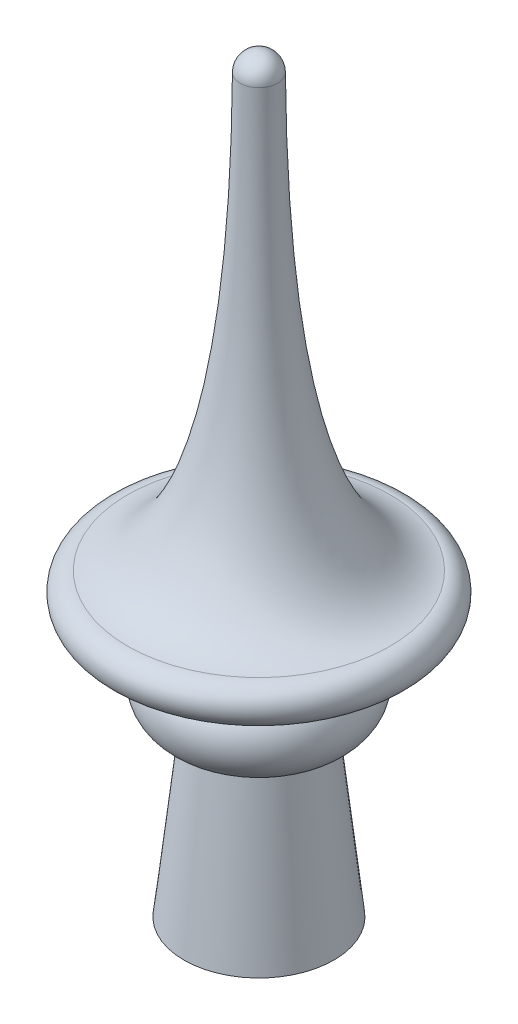
ISO-10303-21;
HEADER;
FILE_DESCRIPTION(('STEP AP214'),'2;1');
FILE_NAME('part.step','',(''),(''),'','','');
FILE_SCHEMA(('AUTOMOTIVE_DESIGN { 1 0 10303 214 1 1 1 1 }'));
ENDSEC;
DATA;
#1=APPLICATION_CONTEXT('core data for automotive mechanical design processes');
#2=APPLICATION_PROTOCOL_DEFINITION('international standard','automotive_design',2000,#1);
#3=PRODUCT_CONTEXT('',#1,'mechanical');
#4=PRODUCT('Part','Part','',(#3));
#5=PRODUCT_RELATED_PRODUCT_CATEGORY('part','',(#4));
#6=PRODUCT_DEFINITION_FORMATION('','',#4);
#7=PRODUCT_DEFINITION_CONTEXT('part definition',#1,'design');
#8=PRODUCT_DEFINITION('design','',#6,#7);
#9=PRODUCT_DEFINITION_SHAPE('','',#8);
#10=(LENGTH_UNIT() NAMED_UNIT(*) SI_UNIT(.MILLI.,.METRE.));
#11=(NAMED_UNIT(*) PLANE_ANGLE_UNIT() SI_UNIT($,.RADIAN.));
#12=(NAMED_UNIT(*) SI_UNIT($,.STERADIAN.) SOLID_ANGLE_UNIT());
#13=UNCERTAINTY_MEASURE_WITH_UNIT(LENGTH_MEASURE(1.E-05),#10,'distance_accuracy_value','');
#14=(GEOMETRIC_REPRESENTATION_CONTEXT(3) GLOBAL_UNCERTAINTY_ASSIGNED_CONTEXT((#13)) GLOBAL_UNIT_ASSIGNED_CONTEXT((#10,
#11,#12)) REPRESENTATION_CONTEXT('',''));
#15=CARTESIAN_POINT('',(0.,0.,0.));
#16=DIRECTION('',(0.,0.,1.));
#17=DIRECTION('',(1.,0.,0.));
#18=AXIS2_PLACEMENT_3D('',#15,#16,#17);
#19=CARTESIAN_POINT('',(0.,195.,0.));
#20=DIRECTION('',(0.,1.,0.));
#21=DIRECTION('',(1.,0.,0.));
#22=AXIS2_PLACEMENT_3D('',#19,#20,#21);
#23=SPHERICAL_SURFACE('',#22,4.99999999999988);
#24=CARTESIAN_POINT('',(0.,195.,0.));
#25=DIRECTION('',(0.,1.,0.));
#26=DIRECTION('',(0.,0.,1.));
#27=AXIS2_PLACEMENT_3D('',#24,#25,#26);
#28=CIRCLE('',#27,5.00000000000001);
#29=CARTESIAN_POINT('',(0.,195.,5.00000000000001));
#30=VERTEX_POINT('',#29);
#31=EDGE_CURVE('E10',#30,#30,#28,.T.);
#32=ORIENTED_EDGE('',*,*,#31,.T.);
#33=EDGE_LOOP('',(#32));
#34=FACE_BOUND('',#33,.T.);
#35=ADVANCED_FACE('F31',(#34),#23,.T.);
#36=CARTESIAN_POINT('',(35.0000000000003,79.9999999999999,0.));
#37=CARTESIAN_POINT('',(5.71754672525257,84.9631749134659,0.));
#38=CARTESIAN_POINT('',(5.00000000000001,195.,0.));
#39=B_SPLINE_CURVE_WITH_KNOTS('',2,(#36,#37,#38),.UNSPECIFIED.,.F.,.F.,(3,3),(0.,1.),.UNSPECIFIED.);
#40=CARTESIAN_POINT('',(0.,200.,0.));
#41=DIRECTION('',(0.,1.,0.));
#42=AXIS1_PLACEMENT('',#40,#41);
#43=SURFACE_OF_REVOLUTION('',#39,#42);
#44=ORIENTED_EDGE('',*,*,#31,.F.);
#45=EDGE_LOOP('',(#44));
#46=FACE_BOUND('',#45,.T.);
#47=CARTESIAN_POINT('',(0.,80.,0.));
#48=DIRECTION('',(0.,1.,0.));
#49=DIRECTION('',(0.,0.,1.));
#50=AXIS2_PLACEMENT_3D('',#47,#48,#49);
#51=CIRCLE('',#50,35.);
#52=CARTESIAN_POINT('',(0.,80.,35.));
#53=VERTEX_POINT('',#52);
#54=EDGE_CURVE('E37',#53,#53,#51,.T.);
#55=ORIENTED_EDGE('',*,*,#54,.T.);
#56=EDGE_LOOP('',(#55));
#57=FACE_BOUND('',#56,.T.);
#58=ADVANCED_FACE('F69',(#46,#57),#43,.T.);
#59=CARTESIAN_POINT('',(0.,75.,0.));
#60=DIRECTION('',(0.,1.,0.));
#61=DIRECTION('',(0.,0.,1.));
#62=AXIS2_PLACEMENT_3D('',#59,#60,#61);
#63=TOROIDAL_SURFACE('',#62,35.,5.);
#64=ORIENTED_EDGE('',*,*,#54,.F.);
#65=EDGE_LOOP('',(#64));
#66=FACE_BOUND('',#65,.T.);
#67=CARTESIAN_POINT('',(0.,70.,0.));
#68=DIRECTION('',(0.,1.,0.));
#69=DIRECTION('',(0.,0.,1.));
#70=AXIS2_PLACEMENT_3D('',#67,#68,#69);
#71=CIRCLE('',#70,35.);
#72=CARTESIAN_POINT('',(0.,70.,35.));
#73=VERTEX_POINT('',#72);
#74=EDGE_CURVE('E41',#73,#73,#71,.T.);
#75=ORIENTED_EDGE('',*,*,#74,.T.);
#76=EDGE_LOOP('',(#75));
#77=FACE_BOUND('',#76,.T.);
#78=ADVANCED_FACE('F72',(#66,#77),#63,.T.);
#79=CARTESIAN_POINT('',(15.,70.,0.));
#80=DIRECTION('',(0.,1.,0.));
#81=DIRECTION('',(0.,0.,1.));
#82=AXIS2_PLACEMENT_3D('',#79,#80,#81);
#83=PLANE('',#82);
#84=ORIENTED_EDGE('',*,*,#74,.F.);
#85=EDGE_LOOP('',(#84));
#86=FACE_BOUND('',#85,.T.);
#87=CARTESIAN_POINT('',(0.,70.,0.));
#88=DIRECTION('',(0.,1.,0.));
#89=DIRECTION('',(0.,0.,1.));
#90=AXIS2_PLACEMENT_3D('',#87,#88,#89);
#91=CIRCLE('',#90,15.);
#92=CARTESIAN_POINT('',(0.,70.,15.));
#93=VERTEX_POINT('',#92);
#94=EDGE_CURVE('E45',#93,#93,#91,.T.);
#95=ORIENTED_EDGE('',*,*,#94,.T.);
#96=EDGE_LOOP('',(#95));
#97=FACE_BOUND('',#96,.T.);
#98=ADVANCED_FACE('F76',(#86,#97),#83,.F.);
#99=CARTESIAN_POINT('',(0.,200.,0.));
#100=DIRECTION('',(0.,1.,0.));
#101=DIRECTION('',(0.,0.,1.));
#102=AXIS2_PLACEMENT_3D('',#99,#100,#101);
#103=CYLINDRICAL_SURFACE('',#102,15.);
#104=ORIENTED_EDGE('',*,*,#94,.F.);
#105=EDGE_LOOP('',(#104));
#106=FACE_BOUND('',#105,.T.);
#107=CARTESIAN_POINT('',(0.,65.,0.));
#108=DIRECTION('',(0.,1.,0.));
#109=DIRECTION('',(0.,0.,1.));
#110=AXIS2_PLACEMENT_3D('',#107,#108,#109);
#111=CIRCLE('',#110,15.);
#112=CARTESIAN_POINT('',(0.,65.,15.));
#113=VERTEX_POINT('',#112);
#114=EDGE_CURVE('E50',#113,#113,#111,.T.);
#115=ORIENTED_EDGE('',*,*,#114,.T.);
#116=EDGE_LOOP('',(#115));
#117=FACE_BOUND('',#116,.T.);
#118=ADVANCED_FACE('F80',(#106,#117),#103,.T.);
#119=CARTESIAN_POINT('',(0.,55.,0.));
#120=DIRECTION('',(0.,1.,0.));
#121=DIRECTION('',(0.,0.,1.));
#122=AXIS2_PLACEMENT_3D('',#119,#120,#121);
#123=TOROIDAL_SURFACE('',#122,15.,10.);
#124=ORIENTED_EDGE('',*,*,#114,.F.);
#125=EDGE_LOOP('',(#124));
#126=FACE_BOUND('',#125,.T.);
#127=CARTESIAN_POINT('',(0.,45.,0.));
#128=DIRECTION('',(0.,1.,0.));
#129=DIRECTION('',(0.,0.,1.));
#130=AXIS2_PLACEMENT_3D('',#127,#128,#129);
#131=CIRCLE('',#130,15.);
#132=CARTESIAN_POINT('',(0.,45.,15.));
#133=VERTEX_POINT('',#132);
#134=EDGE_CURVE('E53',#133,#133,#131,.T.);
#135=ORIENTED_EDGE('',*,*,#134,.T.);
#136=EDGE_LOOP('',(#135));
#137=FACE_BOUND('',#136,.T.);
#138=ADVANCED_FACE('F84',(#126,#137),#123,.T.);
#139=CARTESIAN_POINT('',(0.,0.,0.));
#140=DIRECTION('',(0.,-1.,0.));
#141=DIRECTION('',(0.,0.,-1.));
#142=AXIS2_PLACEMENT_3D('',#139,#140,#141);
#143=CONICAL_SURFACE('',#142,20.,0.110657221173896);
#144=ORIENTED_EDGE('',*,*,#134,.F.);
#145=EDGE_LOOP('',(#144));
#146=FACE_BOUND('',#145,.T.);
#147=CARTESIAN_POINT('',(0.,0.,0.));
#148=DIRECTION('',(0.,1.,0.));
#149=DIRECTION('',(0.,0.,1.));
#150=AXIS2_PLACEMENT_3D('',#147,#148,#149);
#151=CIRCLE('',#150,20.);
#152=CARTESIAN_POINT('',(0.,0.,20.));
#153=VERTEX_POINT('',#152);
#154=EDGE_CURVE('E56',#153,#153,#151,.T.);
#155=ORIENTED_EDGE('',*,*,#154,.T.);
#156=EDGE_LOOP('',(#155));
#157=FACE_BOUND('',#156,.T.);
#158=ADVANCED_FACE('F88',(#146,#157),#143,.T.);
#159=CARTESIAN_POINT('',(20.,0.,0.));
#160=DIRECTION('',(0.,1.,0.));
#161=DIRECTION('',(0.,0.,1.));
#162=AXIS2_PLACEMENT_3D('',#159,#160,#161);
#163=PLANE('',#162);
#164=CARTESIAN_POINT('',(0.,0.,0.));
#165=DIRECTION('',(0.,-1.,0.));
#166=DIRECTION('',(0.,0.,-1.));
#167=AXIS2_PLACEMENT_3D('',#164,#165,#166);
#168=CIRCLE('',#167,12.5);
#169=CARTESIAN_POINT('',(0.,0.,-12.5));
#170=VERTEX_POINT('',#169);
#171=EDGE_CURVE('E64',#170,#170,#168,.T.);
#172=ORIENTED_EDGE('',*,*,#171,.F.);
#173=EDGE_LOOP('',(#172));
#174=FACE_BOUND('',#173,.T.);
#175=ORIENTED_EDGE('',*,*,#154,.F.);
#176=EDGE_LOOP('',(#175));
#177=FACE_BOUND('',#176,.T.);
#178=ADVANCED_FACE('F92',(#174,#177),#163,.F.);
#179=CARTESIAN_POINT('',(0.,70.,0.));
#180=DIRECTION('',(0.,-1.,0.));
#181=DIRECTION('',(0.,0.,-1.));
#182=AXIS2_PLACEMENT_3D('',#179,#180,#181);
#183=CYLINDRICAL_SURFACE('',#182,12.5);
#184=CARTESIAN_POINT('',(0.,70.,0.));
#185=DIRECTION('',(0.,-1.,0.));
#186=DIRECTION('',(0.,0.,-1.));
#187=AXIS2_PLACEMENT_3D('',#184,#185,#186);
#188=CIRCLE('',#187,12.5);
#189=CARTESIAN_POINT('',(0.,70.,-12.5));
#190=VERTEX_POINT('',#189);
#191=EDGE_CURVE('E59',#190,#190,#188,.T.);
#192=ORIENTED_EDGE('',*,*,#191,.F.);
#193=EDGE_LOOP('',(#192));
#194=FACE_BOUND('',#193,.T.);
#195=ORIENTED_EDGE('',*,*,#171,.T.);
#196=EDGE_LOOP('',(#195));
#197=FACE_BOUND('',#196,.T.);
#198=ADVANCED_FACE('F96',(#194,#197),#183,.F.);
#199=CARTESIAN_POINT('',(0.,70.,0.));
#200=DIRECTION('',(0.,-1.,0.));
#201=DIRECTION('',(0.,0.,-1.));
#202=AXIS2_PLACEMENT_3D('',#199,#200,#201);
#203=PLANE('',#202);
#204=ORIENTED_EDGE('',*,*,#191,.T.);
#205=EDGE_LOOP('',(#204));
#206=FACE_BOUND('',#205,.T.);
#207=ADVANCED_FACE('F100',(#206),#203,.T.);
#208=CLOSED_SHELL('',(#35,#58,#78,#98,#118,#138,#158,#178,#198,#207));
#209=MANIFOLD_SOLID_BREP('B2',#208);
#210=ADVANCED_BREP_SHAPE_REPRESENTATION('',(#18,#209),#14);
#211=SHAPE_DEFINITION_REPRESENTATION(#9,#210);
ENDSEC;
END-ISO-10303-21;
